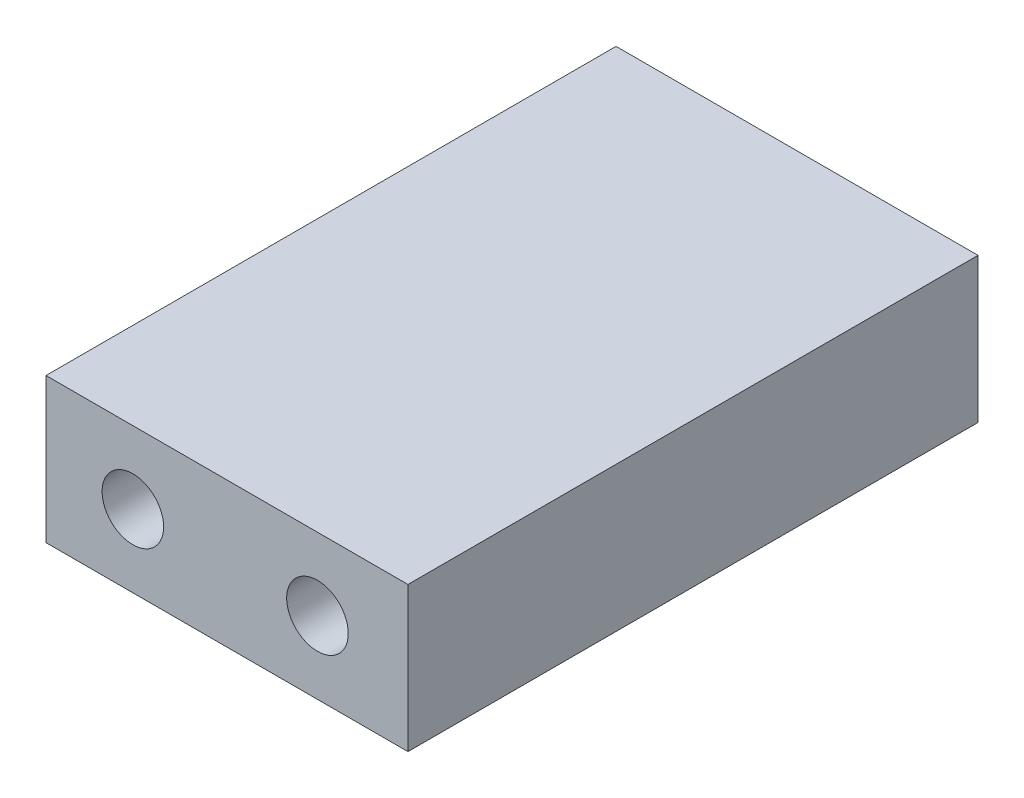
ISO-10303-21;
HEADER;
FILE_DESCRIPTION(('STEP AP214'),'2;1');
FILE_NAME('part.step','',(''),(''),'','','');
FILE_SCHEMA(('AUTOMOTIVE_DESIGN { 1 0 10303 214 1 1 1 1 }'));
ENDSEC;
DATA;
#1=APPLICATION_CONTEXT('core data for automotive mechanical design processes');
#2=APPLICATION_PROTOCOL_DEFINITION('international standard','automotive_design',2000,#1);
#3=PRODUCT_CONTEXT('',#1,'mechanical');
#4=PRODUCT('Part','Part','',(#3));
#5=PRODUCT_RELATED_PRODUCT_CATEGORY('part','',(#4));
#6=PRODUCT_DEFINITION_FORMATION('','',#4);
#7=PRODUCT_DEFINITION_CONTEXT('part definition',#1,'design');
#8=PRODUCT_DEFINITION('design','',#6,#7);
#9=PRODUCT_DEFINITION_SHAPE('','',#8);
#10=(LENGTH_UNIT() NAMED_UNIT(*) SI_UNIT(.MILLI.,.METRE.));
#11=(NAMED_UNIT(*) PLANE_ANGLE_UNIT() SI_UNIT($,.RADIAN.));
#12=(NAMED_UNIT(*) SI_UNIT($,.STERADIAN.) SOLID_ANGLE_UNIT());
#13=UNCERTAINTY_MEASURE_WITH_UNIT(LENGTH_MEASURE(1.E-05),#10,'distance_accuracy_value','');
#14=(GEOMETRIC_REPRESENTATION_CONTEXT(3) GLOBAL_UNCERTAINTY_ASSIGNED_CONTEXT((#13)) GLOBAL_UNIT_ASSIGNED_CONTEXT((#10,
#11,#12)) REPRESENTATION_CONTEXT('',''));
#15=CARTESIAN_POINT('',(0.,0.,0.));
#16=DIRECTION('',(0.,0.,1.));
#17=DIRECTION('',(1.,0.,0.));
#18=AXIS2_PLACEMENT_3D('',#15,#16,#17);
#19=CARTESIAN_POINT('',(-17.3147587548115,-5.17171717171924,31.5));
#20=DIRECTION('',(1.,0.,0.));
#21=DIRECTION('',(0.,0.,-1.));
#22=AXIS2_PLACEMENT_3D('',#19,#20,#21);
#23=PLANE('',#22);
#24=DIRECTION('',(0.,-1.,0.));
#25=VECTOR('',#24,1.);
#26=CARTESIAN_POINT('',(-17.3147587548115,-5.17171717171924,0.));
#27=LINE('',#26,#25);
#28=CARTESIAN_POINT('',(-17.3147587548115,2.82828282828076,0.));
#29=VERTEX_POINT('',#28);
#30=CARTESIAN_POINT('',(-17.3147587548115,-5.17171717171924,0.));
#31=VERTEX_POINT('',#30);
#32=EDGE_CURVE('E96',#29,#31,#27,.T.);
#33=ORIENTED_EDGE('',*,*,#32,.T.);
#34=DIRECTION('',(0.,0.,-1.));
#35=VECTOR('',#34,1.);
#36=CARTESIAN_POINT('',(-17.3147587548115,-5.17171717171924,31.5));
#37=LINE('',#36,#35);
#38=CARTESIAN_POINT('',(-17.3147587548115,-5.17171717171924,31.5));
#39=VERTEX_POINT('',#38);
#40=EDGE_CURVE('E11',#39,#31,#37,.T.);
#41=ORIENTED_EDGE('',*,*,#40,.F.);
#42=DIRECTION('',(0.,-1.,0.));
#43=VECTOR('',#42,1.);
#44=CARTESIAN_POINT('',(-17.3147587548115,-5.17171717171924,31.5));
#45=LINE('',#44,#43);
#46=CARTESIAN_POINT('',(-17.3147587548115,2.82828282828076,31.5));
#47=VERTEX_POINT('',#46);
#48=EDGE_CURVE('E84',#47,#39,#45,.T.);
#49=ORIENTED_EDGE('',*,*,#48,.F.);
#50=DIRECTION('',(0.,0.,-1.));
#51=VECTOR('',#50,1.);
#52=CARTESIAN_POINT('',(-17.3147587548115,2.82828282828076,31.5));
#53=LINE('',#52,#51);
#54=EDGE_CURVE('E92',#47,#29,#53,.T.);
#55=ORIENTED_EDGE('',*,*,#54,.T.);
#56=EDGE_LOOP('',(#33,#41,#49,#55));
#57=FACE_BOUND('',#56,.T.);
#58=ADVANCED_FACE('F33',(#57),#23,.F.);
#59=CARTESIAN_POINT('',(-17.3147587548115,-5.17171717171924,31.5));
#60=DIRECTION('',(0.,1.,0.));
#61=DIRECTION('',(-1.,0.,0.));
#62=AXIS2_PLACEMENT_3D('',#59,#60,#61);
#63=PLANE('',#62);
#64=DIRECTION('',(1.,0.,0.));
#65=VECTOR('',#64,1.);
#66=CARTESIAN_POINT('',(-17.3147587548115,-5.17171717171924,0.));
#67=LINE('',#66,#65);
#68=CARTESIAN_POINT('',(2.68524124518849,-5.17171717171924,0.));
#69=VERTEX_POINT('',#68);
#70=EDGE_CURVE('E88',#31,#69,#67,.T.);
#71=ORIENTED_EDGE('',*,*,#70,.T.);
#72=DIRECTION('',(0.,0.,-1.));
#73=VECTOR('',#72,1.);
#74=CARTESIAN_POINT('',(2.68524124518849,-5.17171717171924,31.5));
#75=LINE('',#74,#73);
#76=CARTESIAN_POINT('',(2.68524124518849,-5.17171717171924,31.5));
#77=VERTEX_POINT('',#76);
#78=EDGE_CURVE('E41',#77,#69,#75,.T.);
#79=ORIENTED_EDGE('',*,*,#78,.F.);
#80=DIRECTION('',(1.,0.,0.));
#81=VECTOR('',#80,1.);
#82=CARTESIAN_POINT('',(-17.3147587548115,-5.17171717171924,31.5));
#83=LINE('',#82,#81);
#84=EDGE_CURVE('E79',#39,#77,#83,.T.);
#85=ORIENTED_EDGE('',*,*,#84,.F.);
#86=ORIENTED_EDGE('',*,*,#40,.T.);
#87=EDGE_LOOP('',(#71,#79,#85,#86));
#88=FACE_BOUND('',#87,.T.);
#89=ADVANCED_FACE('F87',(#88),#63,.F.);
#90=CARTESIAN_POINT('',(2.68524124518849,-5.17171717171924,31.5));
#91=DIRECTION('',(-1.,0.,0.));
#92=DIRECTION('',(0.,0.,1.));
#93=AXIS2_PLACEMENT_3D('',#90,#91,#92);
#94=PLANE('',#93);
#95=DIRECTION('',(0.,1.,0.));
#96=VECTOR('',#95,1.);
#97=CARTESIAN_POINT('',(2.68524124518849,-5.17171717171924,0.));
#98=LINE('',#97,#96);
#99=CARTESIAN_POINT('',(2.68524124518849,2.82828282828076,0.));
#100=VERTEX_POINT('',#99);
#101=EDGE_CURVE('E66',#69,#100,#98,.T.);
#102=ORIENTED_EDGE('',*,*,#101,.T.);
#103=DIRECTION('',(0.,0.,-1.));
#104=VECTOR('',#103,1.);
#105=CARTESIAN_POINT('',(2.68524124518849,2.82828282828076,31.5));
#106=LINE('',#105,#104);
#107=CARTESIAN_POINT('',(2.68524124518849,2.82828282828076,31.5));
#108=VERTEX_POINT('',#107);
#109=EDGE_CURVE('E89',#108,#100,#106,.T.);
#110=ORIENTED_EDGE('',*,*,#109,.F.);
#111=DIRECTION('',(0.,1.,0.));
#112=VECTOR('',#111,1.);
#113=CARTESIAN_POINT('',(2.68524124518849,-5.17171717171924,31.5));
#114=LINE('',#113,#112);
#115=EDGE_CURVE('E82',#77,#108,#114,.T.);
#116=ORIENTED_EDGE('',*,*,#115,.F.);
#117=ORIENTED_EDGE('',*,*,#78,.T.);
#118=EDGE_LOOP('',(#102,#110,#116,#117));
#119=FACE_BOUND('',#118,.T.);
#120=ADVANCED_FACE('F90',(#119),#94,.F.);
#121=CARTESIAN_POINT('',(-17.3147587548115,2.82828282828076,31.5));
#122=DIRECTION('',(0.,-1.,0.));
#123=DIRECTION('',(0.,0.,-1.));
#124=AXIS2_PLACEMENT_3D('',#121,#122,#123);
#125=PLANE('',#124);
#126=DIRECTION('',(-1.,0.,0.));
#127=VECTOR('',#126,1.);
#128=CARTESIAN_POINT('',(-17.3147587548115,2.82828282828076,0.));
#129=LINE('',#128,#127);
#130=EDGE_CURVE('E72',#100,#29,#129,.T.);
#131=ORIENTED_EDGE('',*,*,#130,.T.);
#132=ORIENTED_EDGE('',*,*,#54,.F.);
#133=DIRECTION('',(-1.,0.,0.));
#134=VECTOR('',#133,1.);
#135=CARTESIAN_POINT('',(-17.3147587548115,2.82828282828076,31.5));
#136=LINE('',#135,#134);
#137=EDGE_CURVE('E49',#108,#47,#136,.T.);
#138=ORIENTED_EDGE('',*,*,#137,.F.);
#139=ORIENTED_EDGE('',*,*,#109,.T.);
#140=EDGE_LOOP('',(#131,#132,#138,#139));
#141=FACE_BOUND('',#140,.T.);
#142=ADVANCED_FACE('F104',(#141),#125,.F.);
#143=CARTESIAN_POINT('',(0.,0.,31.5));
#144=DIRECTION('',(0.,0.,-1.));
#145=DIRECTION('',(-1.,0.,0.));
#146=AXIS2_PLACEMENT_3D('',#143,#144,#145);
#147=PLANE('',#146);
#148=CARTESIAN_POINT('',(-12.5147587548115,-1.17171717171924,31.5));
#149=DIRECTION('',(0.,0.,1.));
#150=DIRECTION('',(1.,0.,0.));
#151=AXIS2_PLACEMENT_3D('',#148,#149,#150);
#152=CIRCLE('',#151,1.69999999999999);
#153=CARTESIAN_POINT('',(-10.8147587548115,-1.17171717171924,31.5));
#154=VERTEX_POINT('',#153);
#155=EDGE_CURVE('E115',#154,#154,#152,.T.);
#156=ORIENTED_EDGE('',*,*,#155,.F.);
#157=EDGE_LOOP('',(#156));
#158=FACE_BOUND('',#157,.T.);
#159=CARTESIAN_POINT('',(-2.31475875481151,-1.17171717171924,31.5));
#160=DIRECTION('',(0.,0.,1.));
#161=DIRECTION('',(1.,0.,0.));
#162=AXIS2_PLACEMENT_3D('',#159,#160,#161);
#163=CIRCLE('',#162,1.69999999999999);
#164=CARTESIAN_POINT('',(-0.614758754811521,-1.17171717171924,31.5));
#165=VERTEX_POINT('',#164);
#166=EDGE_CURVE('E112',#165,#165,#163,.T.);
#167=ORIENTED_EDGE('',*,*,#166,.F.);
#168=EDGE_LOOP('',(#167));
#169=FACE_BOUND('',#168,.T.);
#170=ORIENTED_EDGE('',*,*,#48,.T.);
#171=ORIENTED_EDGE('',*,*,#84,.T.);
#172=ORIENTED_EDGE('',*,*,#115,.T.);
#173=ORIENTED_EDGE('',*,*,#137,.T.);
#174=EDGE_LOOP('',(#170,#171,#172,#173));
#175=FACE_BOUND('',#174,.T.);
#176=ADVANCED_FACE('F80',(#158,#169,#175),#147,.F.);
#177=CARTESIAN_POINT('',(0.,0.,0.));
#178=DIRECTION('',(0.,0.,-1.));
#179=DIRECTION('',(-1.,0.,0.));
#180=AXIS2_PLACEMENT_3D('',#177,#178,#179);
#181=PLANE('',#180);
#182=CARTESIAN_POINT('',(-12.5147587548115,-1.17171717171924,0.));
#183=DIRECTION('',(0.,0.,1.));
#184=DIRECTION('',(1.,0.,0.));
#185=AXIS2_PLACEMENT_3D('',#182,#183,#184);
#186=CIRCLE('',#185,1.69999999999999);
#187=CARTESIAN_POINT('',(-10.8147587548115,-1.17171717171924,0.));
#188=VERTEX_POINT('',#187);
#189=EDGE_CURVE('E118',#188,#188,#186,.T.);
#190=ORIENTED_EDGE('',*,*,#189,.T.);
#191=EDGE_LOOP('',(#190));
#192=FACE_BOUND('',#191,.T.);
#193=CARTESIAN_POINT('',(-2.31475875481151,-1.17171717171924,0.));
#194=DIRECTION('',(0.,0.,1.));
#195=DIRECTION('',(1.,0.,0.));
#196=AXIS2_PLACEMENT_3D('',#193,#194,#195);
#197=CIRCLE('',#196,1.69999999999999);
#198=CARTESIAN_POINT('',(-0.614758754811517,-1.17171717171924,0.));
#199=VERTEX_POINT('',#198);
#200=EDGE_CURVE('E99',#199,#199,#197,.T.);
#201=ORIENTED_EDGE('',*,*,#200,.T.);
#202=EDGE_LOOP('',(#201));
#203=FACE_BOUND('',#202,.T.);
#204=ORIENTED_EDGE('',*,*,#32,.F.);
#205=ORIENTED_EDGE('',*,*,#130,.F.);
#206=ORIENTED_EDGE('',*,*,#101,.F.);
#207=ORIENTED_EDGE('',*,*,#70,.F.);
#208=EDGE_LOOP('',(#204,#205,#206,#207));
#209=FACE_BOUND('',#208,.T.);
#210=ADVANCED_FACE('F107',(#192,#203,#209),#181,.T.);
#211=CARTESIAN_POINT('',(-2.31475875481151,-1.17171717171924,31.5));
#212=DIRECTION('',(0.,0.,1.));
#213=DIRECTION('',(1.,0.,0.));
#214=AXIS2_PLACEMENT_3D('',#211,#212,#213);
#215=CYLINDRICAL_SURFACE('',#214,1.69999999999999);
#216=ORIENTED_EDGE('',*,*,#200,.F.);
#217=EDGE_LOOP('',(#216));
#218=FACE_BOUND('',#217,.T.);
#219=ORIENTED_EDGE('',*,*,#166,.T.);
#220=EDGE_LOOP('',(#219));
#221=FACE_BOUND('',#220,.T.);
#222=ADVANCED_FACE('F127',(#218,#221),#215,.F.);
#223=CARTESIAN_POINT('',(-12.5147587548115,-1.17171717171924,31.5));
#224=DIRECTION('',(0.,0.,1.));
#225=DIRECTION('',(1.,0.,0.));
#226=AXIS2_PLACEMENT_3D('',#223,#224,#225);
#227=CYLINDRICAL_SURFACE('',#226,1.69999999999999);
#228=ORIENTED_EDGE('',*,*,#189,.F.);
#229=EDGE_LOOP('',(#228));
#230=FACE_BOUND('',#229,.T.);
#231=ORIENTED_EDGE('',*,*,#155,.T.);
#232=EDGE_LOOP('',(#231));
#233=FACE_BOUND('',#232,.T.);
#234=ADVANCED_FACE('F124',(#230,#233),#227,.F.);
#235=CLOSED_SHELL('',(#58,#89,#120,#142,#176,#210,#222,#234));
#236=MANIFOLD_SOLID_BREP('B2',#235);
#237=ADVANCED_BREP_SHAPE_REPRESENTATION('',(#18,#236),#14);
#238=SHAPE_DEFINITION_REPRESENTATION(#9,#237);
ENDSEC;
END-ISO-10303-21;
